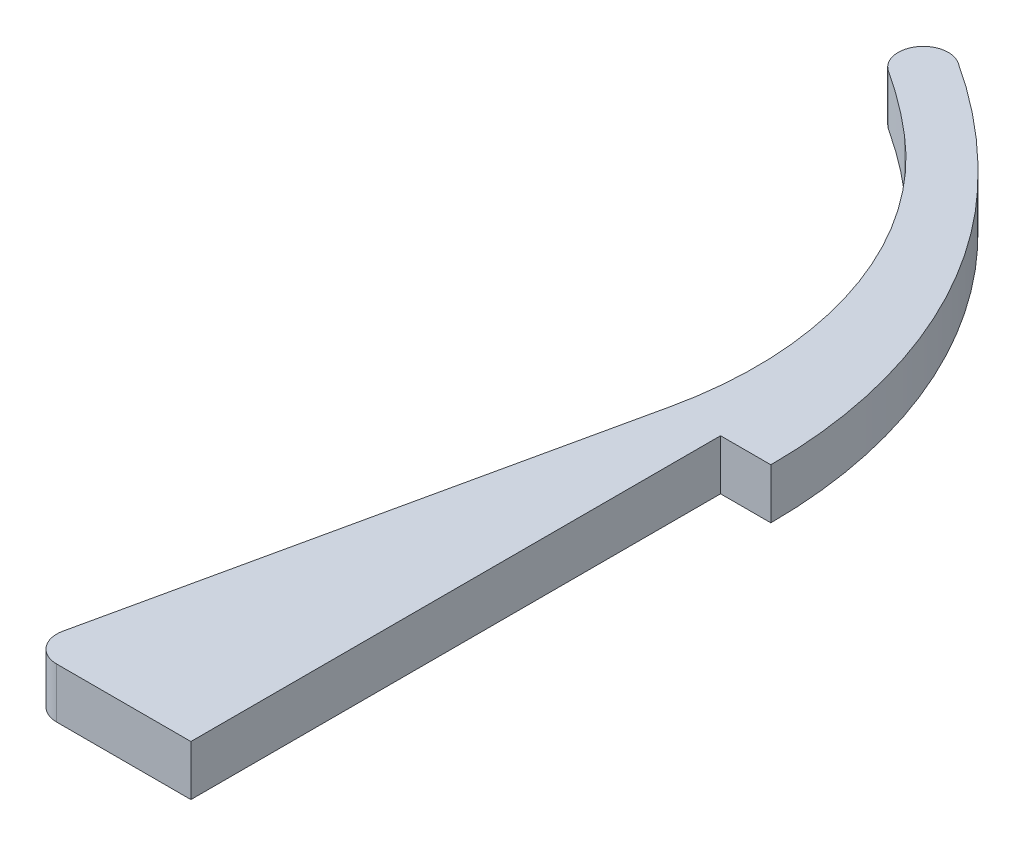
ISO-10303-21;
HEADER;
FILE_DESCRIPTION(('STEP AP214'),'2;1');
FILE_NAME('part.step','',(''),(''),'','','');
FILE_SCHEMA(('AUTOMOTIVE_DESIGN { 1 0 10303 214 1 1 1 1 }'));
ENDSEC;
DATA;
#1=APPLICATION_CONTEXT('core data for automotive mechanical design processes');
#2=APPLICATION_PROTOCOL_DEFINITION('international standard','automotive_design',2000,#1);
#3=PRODUCT_CONTEXT('',#1,'mechanical');
#4=PRODUCT('Part','Part','',(#3));
#5=PRODUCT_RELATED_PRODUCT_CATEGORY('part','',(#4));
#6=PRODUCT_DEFINITION_FORMATION('','',#4);
#7=PRODUCT_DEFINITION_CONTEXT('part definition',#1,'design');
#8=PRODUCT_DEFINITION('design','',#6,#7);
#9=PRODUCT_DEFINITION_SHAPE('','',#8);
#10=(LENGTH_UNIT() NAMED_UNIT(*) SI_UNIT(.MILLI.,.METRE.));
#11=(NAMED_UNIT(*) PLANE_ANGLE_UNIT() SI_UNIT($,.RADIAN.));
#12=(NAMED_UNIT(*) SI_UNIT($,.STERADIAN.) SOLID_ANGLE_UNIT());
#13=UNCERTAINTY_MEASURE_WITH_UNIT(LENGTH_MEASURE(1.E-05),#10,'distance_accuracy_value','');
#14=(GEOMETRIC_REPRESENTATION_CONTEXT(3) GLOBAL_UNCERTAINTY_ASSIGNED_CONTEXT((#13)) GLOBAL_UNIT_ASSIGNED_CONTEXT((#10,
#11,#12)) REPRESENTATION_CONTEXT('',''));
#15=CARTESIAN_POINT('',(0.,0.,0.));
#16=DIRECTION('',(0.,0.,1.));
#17=DIRECTION('',(1.,0.,0.));
#18=AXIS2_PLACEMENT_3D('',#15,#16,#17);
#19=CARTESIAN_POINT('',(0.,19.05,0.));
#20=DIRECTION('',(-1.,0.,0.));
#21=DIRECTION('',(0.,0.,1.));
#22=AXIS2_PLACEMENT_3D('',#19,#20,#21);
#23=PLANE('',#22);
#24=DIRECTION('',(0.,0.,-1.));
#25=VECTOR('',#24,1.);
#26=CARTESIAN_POINT('',(0.,0.,0.));
#27=LINE('',#26,#25);
#28=CARTESIAN_POINT('',(0.,0.,0.));
#29=VERTEX_POINT('',#28);
#30=CARTESIAN_POINT('',(0.,0.,-200.521500330411));
#31=VERTEX_POINT('',#30);
#32=EDGE_CURVE('E141',#29,#31,#27,.T.);
#33=ORIENTED_EDGE('',*,*,#32,.T.);
#34=DIRECTION('',(0.,-1.,0.));
#35=VECTOR('',#34,1.);
#36=CARTESIAN_POINT('',(0.,19.05,-200.521500330411));
#37=LINE('',#36,#35);
#38=CARTESIAN_POINT('',(0.,19.05,-200.521500330411));
#39=VERTEX_POINT('',#38);
#40=EDGE_CURVE('E11',#39,#31,#37,.T.);
#41=ORIENTED_EDGE('',*,*,#40,.F.);
#42=DIRECTION('',(0.,0.,-1.));
#43=VECTOR('',#42,1.);
#44=CARTESIAN_POINT('',(0.,19.05,0.));
#45=LINE('',#44,#43);
#46=CARTESIAN_POINT('',(0.,19.05,0.));
#47=VERTEX_POINT('',#46);
#48=EDGE_CURVE('E159',#47,#39,#45,.T.);
#49=ORIENTED_EDGE('',*,*,#48,.F.);
#50=DIRECTION('',(0.,-1.,0.));
#51=VECTOR('',#50,1.);
#52=CARTESIAN_POINT('',(0.,19.05,0.));
#53=LINE('',#52,#51);
#54=EDGE_CURVE('E137',#47,#29,#53,.T.);
#55=ORIENTED_EDGE('',*,*,#54,.T.);
#56=EDGE_LOOP('',(#33,#41,#49,#55));
#57=FACE_BOUND('',#56,.T.);
#58=ADVANCED_FACE('F33',(#57),#23,.F.);
#59=CARTESIAN_POINT('',(0.,19.05,-200.521500330411));
#60=DIRECTION('',(0.,0.,-1.));
#61=DIRECTION('',(-1.,0.,0.));
#62=AXIS2_PLACEMENT_3D('',#59,#60,#61);
#63=PLANE('',#62);
#64=DIRECTION('',(1.,0.,0.));
#65=VECTOR('',#64,1.);
#66=CARTESIAN_POINT('',(0.,0.,-200.521500330411));
#67=LINE('',#66,#65);
#68=CARTESIAN_POINT('',(19.0500000000003,0.,-200.521500330411));
#69=VERTEX_POINT('',#68);
#70=EDGE_CURVE('E144',#31,#69,#67,.T.);
#71=ORIENTED_EDGE('',*,*,#70,.T.);
#72=DIRECTION('',(0.,-1.,0.));
#73=VECTOR('',#72,1.);
#74=CARTESIAN_POINT('',(19.0500000000003,19.05,-200.521500330411));
#75=LINE('',#74,#73);
#76=CARTESIAN_POINT('',(19.0500000000003,19.05,-200.521500330411));
#77=VERTEX_POINT('',#76);
#78=EDGE_CURVE('E41',#77,#69,#75,.T.);
#79=ORIENTED_EDGE('',*,*,#78,.F.);
#80=DIRECTION('',(1.,0.,0.));
#81=VECTOR('',#80,1.);
#82=CARTESIAN_POINT('',(0.,19.05,-200.521500330411));
#83=LINE('',#82,#81);
#84=EDGE_CURVE('E98',#39,#77,#83,.T.);
#85=ORIENTED_EDGE('',*,*,#84,.F.);
#86=ORIENTED_EDGE('',*,*,#40,.T.);
#87=EDGE_LOOP('',(#71,#79,#85,#86));
#88=FACE_BOUND('',#87,.T.);
#89=ADVANCED_FACE('F208',(#88),#63,.F.);
#90=CARTESIAN_POINT('',(-170.267627598195,19.05,-200.521500330825));
#91=DIRECTION('',(0.,-1.,0.));
#92=DIRECTION('',(0.,0.,-1.));
#93=AXIS2_PLACEMENT_3D('',#90,#91,#92);
#94=CYLINDRICAL_SURFACE('',#93,189.317627598195);
#95=CARTESIAN_POINT('',(-170.267627598195,0.,-200.521500330825));
#96=DIRECTION('',(0.,1.,0.));
#97=DIRECTION('',(0.,0.,1.));
#98=AXIS2_PLACEMENT_3D('',#95,#96,#97);
#99=CIRCLE('',#98,189.317627598195);
#100=CARTESIAN_POINT('',(-31.9372223321622,0.,-329.772663181858));
#101=VERTEX_POINT('',#100);
#102=EDGE_CURVE('E146',#69,#101,#99,.T.);
#103=ORIENTED_EDGE('',*,*,#102,.T.);
#104=DIRECTION('',(0.,-1.,0.));
#105=VECTOR('',#104,1.);
#106=CARTESIAN_POINT('',(-31.9372223321622,19.05,-329.772663181858));
#107=LINE('',#106,#105);
#108=CARTESIAN_POINT('',(-31.9372223321622,19.05,-329.772663181858));
#109=VERTEX_POINT('',#108);
#110=EDGE_CURVE('E172',#109,#101,#107,.T.);
#111=ORIENTED_EDGE('',*,*,#110,.F.);
#112=CARTESIAN_POINT('',(-170.267627598195,19.05,-200.521500330825));
#113=DIRECTION('',(0.,1.,0.));
#114=DIRECTION('',(0.,0.,1.));
#115=AXIS2_PLACEMENT_3D('',#112,#113,#114);
#116=CIRCLE('',#115,189.317627598195);
#117=EDGE_CURVE('E180',#77,#109,#116,.T.);
#118=ORIENTED_EDGE('',*,*,#117,.F.);
#119=ORIENTED_EDGE('',*,*,#78,.T.);
#120=EDGE_LOOP('',(#103,#111,#118,#119));
#121=FACE_BOUND('',#120,.T.);
#122=ADVANCED_FACE('F178',(#121),#94,.T.);
#123=CARTESIAN_POINT('',(-209.549999999998,19.05,-163.817405502824));
#124=DIRECTION('',(0.,-1.,0.));
#125=DIRECTION('',(0.,0.,-1.));
#126=AXIS2_PLACEMENT_3D('',#123,#124,#125);
#127=CYLINDRICAL_SURFACE('',#126,243.079094827586);
#128=CARTESIAN_POINT('',(-209.549999999998,0.,-163.817405502824));
#129=DIRECTION('',(0.,1.,0.));
#130=DIRECTION('',(0.,0.,-1.));
#131=AXIS2_PLACEMENT_3D('',#128,#129,#130);
#132=CIRCLE('',#131,243.079094827586);
#133=CARTESIAN_POINT('',(-77.3705789288644,0.,-367.817520668229));
#134=VERTEX_POINT('',#133);
#135=EDGE_CURVE('E148',#101,#134,#132,.T.);
#136=ORIENTED_EDGE('',*,*,#135,.T.);
#137=DIRECTION('',(0.,-1.,0.));
#138=VECTOR('',#137,1.);
#139=CARTESIAN_POINT('',(-77.3705789288644,19.05,-367.817520668229));
#140=LINE('',#139,#138);
#141=CARTESIAN_POINT('',(-77.3705789288644,19.05,-367.817520668229));
#142=VERTEX_POINT('',#141);
#143=EDGE_CURVE('E169',#142,#134,#140,.T.);
#144=ORIENTED_EDGE('',*,*,#143,.F.);
#145=CARTESIAN_POINT('',(-209.549999999998,19.05,-163.817405502824));
#146=DIRECTION('',(0.,1.,0.));
#147=DIRECTION('',(0.,0.,-1.));
#148=AXIS2_PLACEMENT_3D('',#145,#146,#147);
#149=CIRCLE('',#148,243.079094827586);
#150=EDGE_CURVE('E198',#109,#142,#149,.T.);
#151=ORIENTED_EDGE('',*,*,#150,.F.);
#152=ORIENTED_EDGE('',*,*,#110,.T.);
#153=EDGE_LOOP('',(#136,#144,#151,#152));
#154=FACE_BOUND('',#153,.T.);
#155=ADVANCED_FACE('F189',(#154),#127,.T.);
#156=CARTESIAN_POINT('',(-82.55,19.05,-359.823821751715));
#157=DIRECTION('',(0.,-1.,0.));
#158=DIRECTION('',(0.,0.,-1.));
#159=AXIS2_PLACEMENT_3D('',#156,#157,#158);
#160=CYLINDRICAL_SURFACE('',#159,9.52500000000001);
#161=CARTESIAN_POINT('',(-82.55,0.,-359.823821751715));
#162=DIRECTION('',(0.,1.,0.));
#163=DIRECTION('',(0.,0.,-1.));
#164=AXIS2_PLACEMENT_3D('',#161,#162,#163);
#165=CIRCLE('',#164,9.52500000000001);
#166=CARTESIAN_POINT('',(-87.7294210711356,0.,-351.830122835201));
#167=VERTEX_POINT('',#166);
#168=EDGE_CURVE('E150',#134,#167,#165,.T.);
#169=ORIENTED_EDGE('',*,*,#168,.T.);
#170=DIRECTION('',(0.,-1.,0.));
#171=VECTOR('',#170,1.);
#172=CARTESIAN_POINT('',(-87.7294210711356,19.05,-351.830122835201));
#173=LINE('',#172,#171);
#174=CARTESIAN_POINT('',(-87.7294210711356,19.05,-351.830122835201));
#175=VERTEX_POINT('',#174);
#176=EDGE_CURVE('E166',#175,#167,#173,.T.);
#177=ORIENTED_EDGE('',*,*,#176,.F.);
#178=CARTESIAN_POINT('',(-82.55,19.05,-359.823821751715));
#179=DIRECTION('',(0.,1.,0.));
#180=DIRECTION('',(0.,0.,-1.));
#181=AXIS2_PLACEMENT_3D('',#178,#179,#180);
#182=CIRCLE('',#181,9.52500000000001);
#183=EDGE_CURVE('E195',#142,#175,#182,.T.);
#184=ORIENTED_EDGE('',*,*,#183,.F.);
#185=ORIENTED_EDGE('',*,*,#143,.T.);
#186=EDGE_LOOP('',(#169,#177,#184,#185));
#187=FACE_BOUND('',#186,.T.);
#188=ADVANCED_FACE('F193',(#187),#160,.T.);
#189=CARTESIAN_POINT('',(-209.549999999998,19.05,-163.817405502824));
#190=DIRECTION('',(0.,-1.,0.));
#191=DIRECTION('',(0.,0.,-1.));
#192=AXIS2_PLACEMENT_3D('',#189,#190,#191);
#193=CYLINDRICAL_SURFACE('',#192,224.029094827586);
#194=CARTESIAN_POINT('',(-209.549999999998,0.,-163.817405502824));
#195=DIRECTION('',(0.,-1.,0.));
#196=DIRECTION('',(0.,0.,-1.));
#197=AXIS2_PLACEMENT_3D('',#194,#195,#196);
#198=CIRCLE('',#197,224.029094827586);
#199=CARTESIAN_POINT('',(-63.6190441172698,0.,-333.797379159784));
#200=VERTEX_POINT('',#199);
#201=EDGE_CURVE('E152',#167,#200,#198,.T.);
#202=ORIENTED_EDGE('',*,*,#201,.T.);
#203=DIRECTION('',(0.,-1.,0.));
#204=VECTOR('',#203,1.);
#205=CARTESIAN_POINT('',(-63.6190441172698,19.05,-333.797379159784));
#206=LINE('',#205,#204);
#207=CARTESIAN_POINT('',(-63.6190441172698,19.05,-333.797379159784));
#208=VERTEX_POINT('',#207);
#209=EDGE_CURVE('E163',#208,#200,#206,.T.);
#210=ORIENTED_EDGE('',*,*,#209,.F.);
#211=CARTESIAN_POINT('',(-209.549999999998,19.05,-163.817405502824));
#212=DIRECTION('',(0.,-1.,0.));
#213=DIRECTION('',(0.,0.,-1.));
#214=AXIS2_PLACEMENT_3D('',#211,#212,#213);
#215=CIRCLE('',#214,224.029094827586);
#216=EDGE_CURVE('E197',#175,#208,#215,.T.);
#217=ORIENTED_EDGE('',*,*,#216,.F.);
#218=ORIENTED_EDGE('',*,*,#176,.T.);
#219=EDGE_LOOP('',(#202,#210,#217,#218));
#220=FACE_BOUND('',#219,.T.);
#221=ADVANCED_FACE('F220',(#220),#193,.F.);
#222=CARTESIAN_POINT('',(-152.842865119038,19.05,-229.869719317401));
#223=DIRECTION('',(0.,-1.,0.));
#224=DIRECTION('',(0.,0.,-1.));
#225=AXIS2_PLACEMENT_3D('',#222,#223,#224);
#226=CYLINDRICAL_SURFACE('',#225,136.97389793121);
#227=CARTESIAN_POINT('',(-152.842865119038,0.,-229.869719317401));
#228=DIRECTION('',(0.,-1.,0.));
#229=DIRECTION('',(0.,0.,-1.));
#230=AXIS2_PLACEMENT_3D('',#227,#228,#229);
#231=CIRCLE('',#230,136.97389793121);
#232=CARTESIAN_POINT('',(-19.05,0.,-200.521500330411));
#233=VERTEX_POINT('',#232);
#234=EDGE_CURVE('E154',#200,#233,#231,.T.);
#235=ORIENTED_EDGE('',*,*,#234,.T.);
#236=DIRECTION('',(0.,-1.,0.));
#237=VECTOR('',#236,1.);
#238=CARTESIAN_POINT('',(-19.05,19.05,-200.521500330411));
#239=LINE('',#238,#237);
#240=CARTESIAN_POINT('',(-19.05,19.05,-200.521500330411));
#241=VERTEX_POINT('',#240);
#242=EDGE_CURVE('E132',#241,#233,#239,.T.);
#243=ORIENTED_EDGE('',*,*,#242,.F.);
#244=CARTESIAN_POINT('',(-152.842865119038,19.05,-229.869719317401));
#245=DIRECTION('',(0.,-1.,0.));
#246=DIRECTION('',(0.,0.,-1.));
#247=AXIS2_PLACEMENT_3D('',#244,#245,#246);
#248=CIRCLE('',#247,136.97389793121);
#249=EDGE_CURVE('E123',#208,#241,#248,.T.);
#250=ORIENTED_EDGE('',*,*,#249,.F.);
#251=ORIENTED_EDGE('',*,*,#209,.T.);
#252=EDGE_LOOP('',(#235,#243,#250,#251));
#253=FACE_BOUND('',#252,.T.);
#254=ADVANCED_FACE('F223',(#253),#226,.F.);
#255=CARTESIAN_POINT('',(-60.4139213005055,19.05,-11.9513678189221));
#256=DIRECTION('',(0.97677635768408,0.,0.214261398925289));
#257=DIRECTION('',(0.214261398925289,0.,-0.97677635768408));
#258=AXIS2_PLACEMENT_3D('',#255,#256,#257);
#259=PLANE('',#258);
#260=DIRECTION('',(-0.214261398925289,0.,0.97677635768408));
#261=VECTOR('',#260,1.);
#262=CARTESIAN_POINT('',(-60.4139213005055,0.,-11.9513678189221));
#263=LINE('',#262,#261);
#264=CARTESIAN_POINT('',(-60.4139213005055,0.,-11.9513678189221));
#265=VERTEX_POINT('',#264);
#266=EDGE_CURVE('E131',#233,#265,#263,.T.);
#267=ORIENTED_EDGE('',*,*,#266,.T.);
#268=DIRECTION('',(0.,-1.,0.));
#269=VECTOR('',#268,1.);
#270=CARTESIAN_POINT('',(-60.4139213005055,19.05,-11.9513678189221));
#271=LINE('',#270,#269);
#272=CARTESIAN_POINT('',(-60.4139213005055,19.05,-11.9513678189221));
#273=VERTEX_POINT('',#272);
#274=EDGE_CURVE('E128',#273,#265,#271,.T.);
#275=ORIENTED_EDGE('',*,*,#274,.F.);
#276=DIRECTION('',(-0.214261398925289,0.,0.97677635768408));
#277=VECTOR('',#276,1.);
#278=CARTESIAN_POINT('',(-60.4139213005055,19.05,-11.9513678189221));
#279=LINE('',#278,#277);
#280=EDGE_CURVE('E117',#241,#273,#279,.T.);
#281=ORIENTED_EDGE('',*,*,#280,.F.);
#282=ORIENTED_EDGE('',*,*,#242,.T.);
#283=EDGE_LOOP('',(#267,#275,#281,#282));
#284=FACE_BOUND('',#283,.T.);
#285=ADVANCED_FACE('F129',(#284),#259,.F.);
#286=CARTESIAN_POINT('',(-50.8,19.05,-9.84249999999995));
#287=DIRECTION('',(0.,-1.,0.));
#288=DIRECTION('',(0.,0.,-1.));
#289=AXIS2_PLACEMENT_3D('',#286,#287,#288);
#290=CYLINDRICAL_SURFACE('',#289,9.84249999999996);
#291=CARTESIAN_POINT('',(-50.8,0.,-9.84249999999995));
#292=DIRECTION('',(0.,1.,0.));
#293=DIRECTION('',(0.,0.,-1.));
#294=AXIS2_PLACEMENT_3D('',#291,#292,#293);
#295=CIRCLE('',#294,9.84249999999996);
#296=CARTESIAN_POINT('',(-50.8,0.,0.));
#297=VERTEX_POINT('',#296);
#298=EDGE_CURVE('E84',#265,#297,#295,.T.);
#299=ORIENTED_EDGE('',*,*,#298,.T.);
#300=DIRECTION('',(0.,-1.,0.));
#301=VECTOR('',#300,1.);
#302=CARTESIAN_POINT('',(-50.8,19.05,0.));
#303=LINE('',#302,#301);
#304=CARTESIAN_POINT('',(-50.8,19.05,0.));
#305=VERTEX_POINT('',#304);
#306=EDGE_CURVE('E133',#305,#297,#303,.T.);
#307=ORIENTED_EDGE('',*,*,#306,.F.);
#308=CARTESIAN_POINT('',(-50.8,19.05,-9.84249999999995));
#309=DIRECTION('',(0.,1.,0.));
#310=DIRECTION('',(0.,0.,-1.));
#311=AXIS2_PLACEMENT_3D('',#308,#309,#310);
#312=CIRCLE('',#311,9.84249999999996);
#313=EDGE_CURVE('E121',#273,#305,#312,.T.);
#314=ORIENTED_EDGE('',*,*,#313,.F.);
#315=ORIENTED_EDGE('',*,*,#274,.T.);
#316=EDGE_LOOP('',(#299,#307,#314,#315));
#317=FACE_BOUND('',#316,.T.);
#318=ADVANCED_FACE('F135',(#317),#290,.T.);
#319=CARTESIAN_POINT('',(0.,19.05,0.));
#320=DIRECTION('',(0.,0.,-1.));
#321=DIRECTION('',(-1.,0.,0.));
#322=AXIS2_PLACEMENT_3D('',#319,#320,#321);
#323=PLANE('',#322);
#324=DIRECTION('',(1.,0.,0.));
#325=VECTOR('',#324,1.);
#326=CARTESIAN_POINT('',(0.,0.,0.));
#327=LINE('',#326,#325);
#328=EDGE_CURVE('E90',#297,#29,#327,.T.);
#329=ORIENTED_EDGE('',*,*,#328,.T.);
#330=ORIENTED_EDGE('',*,*,#54,.F.);
#331=DIRECTION('',(1.,0.,0.));
#332=VECTOR('',#331,1.);
#333=CARTESIAN_POINT('',(0.,19.05,0.));
#334=LINE('',#333,#332);
#335=EDGE_CURVE('E49',#305,#47,#334,.T.);
#336=ORIENTED_EDGE('',*,*,#335,.F.);
#337=ORIENTED_EDGE('',*,*,#306,.T.);
#338=EDGE_LOOP('',(#329,#330,#336,#337));
#339=FACE_BOUND('',#338,.T.);
#340=ADVANCED_FACE('F232',(#339),#323,.F.);
#341=CARTESIAN_POINT('',(-170.267627598195,19.05,-200.521500330825));
#342=DIRECTION('',(0.,1.,0.));
#343=DIRECTION('',(0.,0.,1.));
#344=AXIS2_PLACEMENT_3D('',#341,#342,#343);
#345=PLANE('',#344);
#346=ORIENTED_EDGE('',*,*,#48,.T.);
#347=ORIENTED_EDGE('',*,*,#84,.T.);
#348=ORIENTED_EDGE('',*,*,#117,.T.);
#349=ORIENTED_EDGE('',*,*,#150,.T.);
#350=ORIENTED_EDGE('',*,*,#183,.T.);
#351=ORIENTED_EDGE('',*,*,#216,.T.);
#352=ORIENTED_EDGE('',*,*,#249,.T.);
#353=ORIENTED_EDGE('',*,*,#280,.T.);
#354=ORIENTED_EDGE('',*,*,#313,.T.);
#355=ORIENTED_EDGE('',*,*,#335,.T.);
#356=EDGE_LOOP('',(#346,#347,#348,#349,#350,#351,#352,#353,#354,#355));
#357=FACE_BOUND('',#356,.T.);
#358=ADVANCED_FACE('F119',(#357),#345,.T.);
#359=CARTESIAN_POINT('',(-170.267627598195,0.,-200.521500330825));
#360=DIRECTION('',(0.,1.,0.));
#361=DIRECTION('',(0.,0.,1.));
#362=AXIS2_PLACEMENT_3D('',#359,#360,#361);
#363=PLANE('',#362);
#364=ORIENTED_EDGE('',*,*,#32,.F.);
#365=ORIENTED_EDGE('',*,*,#328,.F.);
#366=ORIENTED_EDGE('',*,*,#298,.F.);
#367=ORIENTED_EDGE('',*,*,#266,.F.);
#368=ORIENTED_EDGE('',*,*,#234,.F.);
#369=ORIENTED_EDGE('',*,*,#201,.F.);
#370=ORIENTED_EDGE('',*,*,#168,.F.);
#371=ORIENTED_EDGE('',*,*,#135,.F.);
#372=ORIENTED_EDGE('',*,*,#102,.F.);
#373=ORIENTED_EDGE('',*,*,#70,.F.);
#374=EDGE_LOOP('',(#364,#365,#366,#367,#368,#369,#370,#371,#372,#373));
#375=FACE_BOUND('',#374,.T.);
#376=ADVANCED_FACE('F184',(#375),#363,.F.);
#377=CLOSED_SHELL('',(#58,#89,#122,#155,#188,#221,#254,#285,#318,#340,#358,#376));
#378=MANIFOLD_SOLID_BREP('B2',#377);
#379=ADVANCED_BREP_SHAPE_REPRESENTATION('',(#18,#378),#14);
#380=SHAPE_DEFINITION_REPRESENTATION(#9,#379);
ENDSEC;
END-ISO-10303-21;
